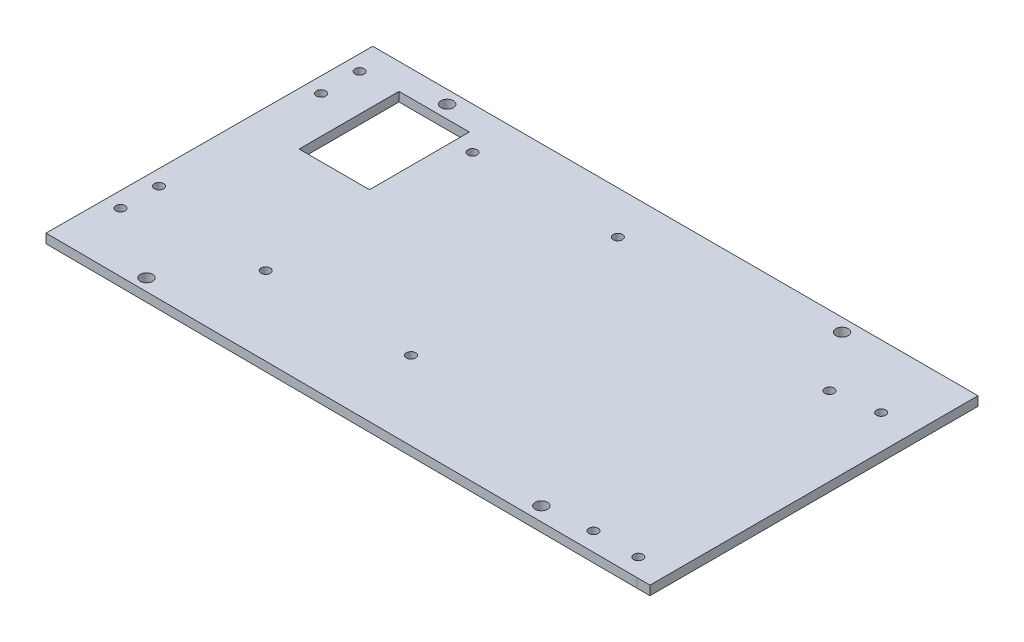
ISO-10303-21;
HEADER;
FILE_DESCRIPTION(('STEP AP214'),'2;1');
FILE_NAME('part.step','',(''),(''),'','','');
FILE_SCHEMA(('AUTOMOTIVE_DESIGN { 1 0 10303 214 1 1 1 1 }'));
ENDSEC;
DATA;
#1=APPLICATION_CONTEXT('core data for automotive mechanical design processes');
#2=APPLICATION_PROTOCOL_DEFINITION('international standard','automotive_design',2000,#1);
#3=PRODUCT_CONTEXT('',#1,'mechanical');
#4=PRODUCT('Part','Part','',(#3));
#5=PRODUCT_RELATED_PRODUCT_CATEGORY('part','',(#4));
#6=PRODUCT_DEFINITION_FORMATION('','',#4);
#7=PRODUCT_DEFINITION_CONTEXT('part definition',#1,'design');
#8=PRODUCT_DEFINITION('design','',#6,#7);
#9=PRODUCT_DEFINITION_SHAPE('','',#8);
#10=(LENGTH_UNIT() NAMED_UNIT(*) SI_UNIT(.MILLI.,.METRE.));
#11=(NAMED_UNIT(*) PLANE_ANGLE_UNIT() SI_UNIT($,.RADIAN.));
#12=(NAMED_UNIT(*) SI_UNIT($,.STERADIAN.) SOLID_ANGLE_UNIT());
#13=UNCERTAINTY_MEASURE_WITH_UNIT(LENGTH_MEASURE(1.E-05),#10,'distance_accuracy_value','');
#14=(GEOMETRIC_REPRESENTATION_CONTEXT(3) GLOBAL_UNCERTAINTY_ASSIGNED_CONTEXT((#13)) GLOBAL_UNIT_ASSIGNED_CONTEXT((#10,
#11,#12)) REPRESENTATION_CONTEXT('',''));
#15=CARTESIAN_POINT('',(0.,0.,0.));
#16=DIRECTION('',(0.,0.,1.));
#17=DIRECTION('',(1.,0.,0.));
#18=AXIS2_PLACEMENT_3D('',#15,#16,#17);
#19=CARTESIAN_POINT('',(0.,3.,0.));
#20=DIRECTION('',(0.,1.,0.));
#21=DIRECTION('',(0.,0.,1.));
#22=AXIS2_PLACEMENT_3D('',#19,#20,#21);
#23=PLANE('',#22);
#24=CARTESIAN_POINT('',(62.5485763507274,3.,-47.5530715626635));
#25=DIRECTION('',(0.,1.,0.));
#26=DIRECTION('',(0.,0.,1.));
#27=AXIS2_PLACEMENT_3D('',#24,#25,#26);
#28=CIRCLE('',#27,2.);
#29=CARTESIAN_POINT('',(62.5485763507274,3.,-45.5530715626635));
#30=VERTEX_POINT('',#29);
#31=EDGE_CURVE('E421',#30,#30,#28,.T.);
#32=ORIENTED_EDGE('',*,*,#31,.F.);
#33=EDGE_LOOP('',(#32));
#34=FACE_BOUND('',#33,.T.);
#35=CARTESIAN_POINT('',(-66.0035544548105,3.,50.3232121505816));
#36=DIRECTION('',(0.,1.,0.));
#37=DIRECTION('',(0.,0.,1.));
#38=AXIS2_PLACEMENT_3D('',#35,#36,#37);
#39=CIRCLE('',#38,2.);
#40=CARTESIAN_POINT('',(-66.0035544548105,3.,52.3232121505816));
#41=VERTEX_POINT('',#40);
#42=EDGE_CURVE('E156',#41,#41,#39,.T.);
#43=ORIENTED_EDGE('',*,*,#42,.F.);
#44=EDGE_LOOP('',(#43));
#45=FACE_BOUND('',#44,.T.);
#46=DIRECTION('',(0.,0.,-1.));
#47=VECTOR('',#46,1.);
#48=CARTESIAN_POINT('',(-94.4584424309316,3.,-48.7725749938729));
#49=LINE('',#48,#47);
#50=CARTESIAN_POINT('',(-94.4584424309316,3.,-48.8206347995592));
#51=VERTEX_POINT('',#50);
#52=CARTESIAN_POINT('',(-94.4584424309316,3.,-51.7725749938729));
#53=VERTEX_POINT('',#52);
#54=EDGE_CURVE('E125',#51,#53,#49,.T.);
#55=ORIENTED_EDGE('',*,*,#54,.F.);
#56=DIRECTION('',(-0.00480598056863235,0.,0.9999884512087));
#57=VECTOR('',#56,1.);
#58=CARTESIAN_POINT('',(-94.6908889943438,3.,-0.455087828247691));
#59=LINE('',#58,#57);
#60=CARTESIAN_POINT('',(-94.9529778314439,3.,54.0781768298242));
#61=VERTEX_POINT('',#60);
#62=EDGE_CURVE('E250',#51,#61,#59,.T.);
#63=ORIENTED_EDGE('',*,*,#62,.T.);
#64=DIRECTION('',(0.9999884512087,0.,0.00480598056863185));
#65=VECTOR('',#64,1.);
#66=CARTESIAN_POINT('',(-0.262088837100033,3.,54.5332646580718));
#67=LINE('',#66,#65);
#68=CARTESIAN_POINT('',(98.3617393098349,3.,55.0072543337579));
#69=VERTEX_POINT('',#68);
#70=EDGE_CURVE('E253',#61,#69,#67,.T.);
#71=ORIENTED_EDGE('',*,*,#70,.T.);
#72=DIRECTION('',(1.,0.,0.));
#73=VECTOR('',#72,1.);
#74=CARTESIAN_POINT('',(0.,3.,55.0072543337579));
#75=LINE('',#74,#73);
#76=CARTESIAN_POINT('',(102.586080733285,3.,55.0072543337579));
#77=VERTEX_POINT('',#76);
#78=EDGE_CURVE('E256',#69,#77,#75,.T.);
#79=ORIENTED_EDGE('',*,*,#78,.T.);
#80=DIRECTION('',(0.,0.,-1.));
#81=VECTOR('',#80,1.);
#82=CARTESIAN_POINT('',(102.586080733285,3.,0.));
#83=LINE('',#82,#81);
#84=CARTESIAN_POINT('',(102.586080733285,3.,-51.7725749938729));
#85=VERTEX_POINT('',#84);
#86=EDGE_CURVE('E147',#77,#85,#83,.T.);
#87=ORIENTED_EDGE('',*,*,#86,.T.);
#88=DIRECTION('',(1.,0.,0.));
#89=VECTOR('',#88,1.);
#90=CARTESIAN_POINT('',(102.586080733285,3.,-51.7725749938729));
#91=LINE('',#90,#89);
#92=EDGE_CURVE('E134',#53,#85,#91,.T.);
#93=ORIENTED_EDGE('',*,*,#92,.F.);
#94=EDGE_LOOP('',(#55,#63,#71,#79,#87,#93));
#95=FACE_BOUND('',#94,.T.);
#96=DIRECTION('',(0.,0.,1.));
#97=VECTOR('',#96,1.);
#98=CARTESIAN_POINT('',(-77.4584424309316,3.,0.));
#99=LINE('',#98,#97);
#100=CARTESIAN_POINT('',(-77.4584424309316,3.,-43.3335681314541));
#101=VERTEX_POINT('',#100);
#102=CARTESIAN_POINT('',(-77.4584424309316,3.,-10.8206347995592));
#103=VERTEX_POINT('',#102);
#104=EDGE_CURVE('E188',#101,#103,#99,.T.);
#105=ORIENTED_EDGE('',*,*,#104,.F.);
#106=DIRECTION('',(1.,0.,0.));
#107=VECTOR('',#106,1.);
#108=CARTESIAN_POINT('',(0.,3.,-43.3335681314541));
#109=LINE('',#108,#107);
#110=CARTESIAN_POINT('',(-54.5486664786895,3.,-43.3335681314541));
#111=VERTEX_POINT('',#110);
#112=EDGE_CURVE('E162',#101,#111,#109,.T.);
#113=ORIENTED_EDGE('',*,*,#112,.T.);
#114=DIRECTION('',(0.,0.,1.));
#115=VECTOR('',#114,1.);
#116=CARTESIAN_POINT('',(-54.5486664786895,3.,0.));
#117=LINE('',#116,#115);
#118=CARTESIAN_POINT('',(-54.5486664786895,3.,-10.8206347995592));
#119=VERTEX_POINT('',#118);
#120=EDGE_CURVE('E61',#111,#119,#117,.T.);
#121=ORIENTED_EDGE('',*,*,#120,.T.);
#122=DIRECTION('',(1.,0.,0.));
#123=VECTOR('',#122,1.);
#124=CARTESIAN_POINT('',(0.,3.,-10.8206347995592));
#125=LINE('',#124,#123);
#126=EDGE_CURVE('E179',#103,#119,#125,.T.);
#127=ORIENTED_EDGE('',*,*,#126,.F.);
#128=EDGE_LOOP('',(#105,#113,#121,#127));
#129=FACE_BOUND('',#128,.T.);
#130=CARTESIAN_POINT('',(92.7573821266623,3.,48.9802502974241));
#131=DIRECTION('',(0.,1.,0.));
#132=DIRECTION('',(0.,0.,1.));
#133=AXIS2_PLACEMENT_3D('',#130,#131,#132);
#134=CIRCLE('',#133,1.5);
#135=CARTESIAN_POINT('',(92.7573821266623,3.,50.4802502974241));
#136=VERTEX_POINT('',#135);
#137=EDGE_CURVE('E201',#136,#136,#134,.T.);
#138=ORIENTED_EDGE('',*,*,#137,.F.);
#139=EDGE_LOOP('',(#138));
#140=FACE_BOUND('',#139,.T.);
#141=CARTESIAN_POINT('',(78.1095131214086,3.,48.909852110599));
#142=DIRECTION('',(0.,1.,0.));
#143=DIRECTION('',(0.,0.,1.));
#144=AXIS2_PLACEMENT_3D('',#141,#142,#143);
#145=CIRCLE('',#144,1.5);
#146=CARTESIAN_POINT('',(78.1095131214086,3.,50.409852110599));
#147=VERTEX_POINT('',#146);
#148=EDGE_CURVE('E205',#147,#147,#145,.T.);
#149=ORIENTED_EDGE('',*,*,#148,.F.);
#150=EDGE_LOOP('',(#149));
#151=FACE_BOUND('',#150,.T.);
#152=CARTESIAN_POINT('',(-48.2970178521656,3.,-38.0986600641648));
#153=DIRECTION('',(0.,1.,0.));
#154=DIRECTION('',(0.,0.,1.));
#155=AXIS2_PLACEMENT_3D('',#152,#153,#154);
#156=CIRCLE('',#155,1.5);
#157=CARTESIAN_POINT('',(-48.2970178521656,3.,-36.5986600641648));
#158=VERTEX_POINT('',#157);
#159=EDGE_CURVE('E210',#158,#158,#156,.T.);
#160=ORIENTED_EDGE('',*,*,#159,.F.);
#161=EDGE_LOOP('',(#160));
#162=FACE_BOUND('',#161,.T.);
#163=CARTESIAN_POINT('',(-0.747960243058551,3.,-37.8701375780802));
#164=DIRECTION('',(0.,1.,0.));
#165=DIRECTION('',(0.,0.,1.));
#166=AXIS2_PLACEMENT_3D('',#163,#164,#165);
#167=CIRCLE('',#166,1.5);
#168=CARTESIAN_POINT('',(-0.747960243058551,3.,-36.3701375780802));
#169=VERTEX_POINT('',#168);
#170=EDGE_CURVE('E214',#169,#169,#167,.T.);
#171=ORIENTED_EDGE('',*,*,#170,.F.);
#172=EDGE_LOOP('',(#171));
#173=FACE_BOUND('',#172,.T.);
#174=CARTESIAN_POINT('',(91.5761646914357,3.,-31.2402327017265));
#175=DIRECTION('',(0.,1.,0.));
#176=DIRECTION('',(0.,0.,1.));
#177=AXIS2_PLACEMENT_3D('',#174,#175,#176);
#178=CIRCLE('',#177,1.5);
#179=CARTESIAN_POINT('',(91.5761646914357,3.,-29.7402327017265));
#180=VERTEX_POINT('',#179);
#181=EDGE_CURVE('E218',#180,#180,#178,.T.);
#182=ORIENTED_EDGE('',*,*,#181,.F.);
#183=EDGE_LOOP('',(#182));
#184=FACE_BOUND('',#183,.T.);
#185=CARTESIAN_POINT('',(77.015212265754,3.,-28.9963068000278));
#186=DIRECTION('',(0.,1.,0.));
#187=DIRECTION('',(0.,0.,1.));
#188=AXIS2_PLACEMENT_3D('',#185,#186,#187);
#189=CIRCLE('',#188,1.5);
#190=CARTESIAN_POINT('',(77.015212265754,3.,-27.4963068000278));
#191=VERTEX_POINT('',#190);
#192=EDGE_CURVE('E222',#191,#191,#189,.T.);
#193=ORIENTED_EDGE('',*,*,#192,.F.);
#194=EDGE_LOOP('',(#193));
#195=FACE_BOUND('',#194,.T.);
#196=CARTESIAN_POINT('',(-48.6190185502639,3.,28.9005661668188));
#197=DIRECTION('',(0.,1.,0.));
#198=DIRECTION('',(0.,0.,1.));
#199=AXIS2_PLACEMENT_3D('',#196,#197,#198);
#200=CIRCLE('',#199,1.5);
#201=CARTESIAN_POINT('',(-48.6190185502639,3.,30.4005661668188));
#202=VERTEX_POINT('',#201);
#203=EDGE_CURVE('E226',#202,#202,#200,.T.);
#204=ORIENTED_EDGE('',*,*,#203,.F.);
#205=EDGE_LOOP('',(#204));
#206=FACE_BOUND('',#205,.T.);
#207=CARTESIAN_POINT('',(-1.06996094115684,3.,29.1290886529034));
#208=DIRECTION('',(0.,1.,0.));
#209=DIRECTION('',(0.,0.,1.));
#210=AXIS2_PLACEMENT_3D('',#207,#208,#209);
#211=CIRCLE('',#210,1.5);
#212=CARTESIAN_POINT('',(-1.06996094115684,3.,30.6290886529034));
#213=VERTEX_POINT('',#212);
#214=EDGE_CURVE('E230',#213,#213,#211,.T.);
#215=ORIENTED_EDGE('',*,*,#214,.F.);
#216=EDGE_LOOP('',(#215));
#217=FACE_BOUND('',#216,.T.);
#218=CARTESIAN_POINT('',(-89.8513890863737,3.,34.9524509895953));
#219=DIRECTION('',(0.,1.,0.));
#220=DIRECTION('',(0.,0.,1.));
#221=AXIS2_PLACEMENT_3D('',#218,#219,#220);
#222=CIRCLE('',#221,1.5);
#223=CARTESIAN_POINT('',(-89.8513890863737,3.,36.4524509895953));
#224=VERTEX_POINT('',#223);
#225=EDGE_CURVE('E234',#224,#224,#222,.T.);
#226=ORIENTED_EDGE('',*,*,#225,.F.);
#227=EDGE_LOOP('',(#226));
#228=FACE_BOUND('',#227,.T.);
#229=CARTESIAN_POINT('',(-89.7913143292658,3.,22.4525953494866));
#230=DIRECTION('',(0.,1.,0.));
#231=DIRECTION('',(0.,0.,1.));
#232=AXIS2_PLACEMENT_3D('',#229,#230,#231);
#233=CIRCLE('',#232,1.5);
#234=CARTESIAN_POINT('',(-89.7913143292658,3.,23.9525953494866));
#235=VERTEX_POINT('',#234);
#236=EDGE_CURVE('E238',#235,#235,#233,.T.);
#237=ORIENTED_EDGE('',*,*,#236,.F.);
#238=EDGE_LOOP('',(#237));
#239=FACE_BOUND('',#238,.T.);
#240=CARTESIAN_POINT('',(-89.488537553442,3.,-42.5466770766617));
#241=DIRECTION('',(0.,1.,0.));
#242=DIRECTION('',(0.,0.,1.));
#243=AXIS2_PLACEMENT_3D('',#240,#241,#242);
#244=CIRCLE('',#243,1.5);
#245=CARTESIAN_POINT('',(-89.488537553442,3.,-41.0466770766617));
#246=VERTEX_POINT('',#245);
#247=EDGE_CURVE('E242',#246,#246,#244,.T.);
#248=ORIENTED_EDGE('',*,*,#247,.F.);
#249=EDGE_LOOP('',(#248));
#250=FACE_BOUND('',#249,.T.);
#251=CARTESIAN_POINT('',(-89.5486123105499,3.,-30.046821436553));
#252=DIRECTION('',(0.,1.,0.));
#253=DIRECTION('',(0.,0.,1.));
#254=AXIS2_PLACEMENT_3D('',#251,#252,#253);
#255=CIRCLE('',#254,1.5);
#256=CARTESIAN_POINT('',(-89.5486123105499,3.,-28.546821436553));
#257=VERTEX_POINT('',#256);
#258=EDGE_CURVE('E246',#257,#257,#255,.T.);
#259=ORIENTED_EDGE('',*,*,#258,.F.);
#260=EDGE_LOOP('',(#259));
#261=FACE_BOUND('',#260,.T.);
#262=CARTESIAN_POINT('',(62.5485763507274,3.,50.3232121505816));
#263=DIRECTION('',(0.,-1.,0.));
#264=DIRECTION('',(0.,0.,-1.));
#265=AXIS2_PLACEMENT_3D('',#262,#263,#264);
#266=CIRCLE('',#265,2.);
#267=CARTESIAN_POINT('',(62.5485763507274,3.,48.3232121505816));
#268=VERTEX_POINT('',#267);
#269=EDGE_CURVE('E405',#268,#268,#266,.T.);
#270=ORIENTED_EDGE('',*,*,#269,.T.);
#271=EDGE_LOOP('',(#270));
#272=FACE_BOUND('',#271,.T.);
#273=CARTESIAN_POINT('',(-66.0035544548105,3.,-47.5530715626635));
#274=DIRECTION('',(0.,-1.,0.));
#275=DIRECTION('',(0.,0.,-1.));
#276=AXIS2_PLACEMENT_3D('',#273,#274,#275);
#277=CIRCLE('',#276,2.);
#278=CARTESIAN_POINT('',(-66.0035544548105,3.,-49.5530715626635));
#279=VERTEX_POINT('',#278);
#280=EDGE_CURVE('E429',#279,#279,#277,.T.);
#281=ORIENTED_EDGE('',*,*,#280,.T.);
#282=EDGE_LOOP('',(#281));
#283=FACE_BOUND('',#282,.T.);
#284=ADVANCED_FACE('F45',(#34,#45,#95,#129,#140,#151,#162,#173,#184,#195,#206,#217,#228,#239,
#250,#261,#272,#283),#23,.T.);
#285=CARTESIAN_POINT('',(0.,0.,0.));
#286=DIRECTION('',(0.,1.,0.));
#287=DIRECTION('',(0.,0.,1.));
#288=AXIS2_PLACEMENT_3D('',#285,#286,#287);
#289=PLANE('',#288);
#290=CARTESIAN_POINT('',(62.5485763507274,0.,50.3232121505816));
#291=DIRECTION('',(0.,-1.,0.));
#292=DIRECTION('',(0.,0.,-1.));
#293=AXIS2_PLACEMENT_3D('',#290,#291,#292);
#294=CIRCLE('',#293,2.);
#295=CARTESIAN_POINT('',(62.5485763507274,0.,48.3232121505816));
#296=VERTEX_POINT('',#295);
#297=EDGE_CURVE('E408',#296,#296,#294,.T.);
#298=ORIENTED_EDGE('',*,*,#297,.F.);
#299=EDGE_LOOP('',(#298));
#300=FACE_BOUND('',#299,.T.);
#301=CARTESIAN_POINT('',(-66.0035544548105,0.,50.3232121505816));
#302=DIRECTION('',(0.,1.,0.));
#303=DIRECTION('',(0.,0.,1.));
#304=AXIS2_PLACEMENT_3D('',#301,#302,#303);
#305=CIRCLE('',#304,2.);
#306=CARTESIAN_POINT('',(-66.0035544548105,0.,52.3232121505816));
#307=VERTEX_POINT('',#306);
#308=EDGE_CURVE('E410',#307,#307,#305,.T.);
#309=ORIENTED_EDGE('',*,*,#308,.T.);
#310=EDGE_LOOP('',(#309));
#311=FACE_BOUND('',#310,.T.);
#312=DIRECTION('',(1.,0.,0.));
#313=VECTOR('',#312,1.);
#314=CARTESIAN_POINT('',(0.,0.,-43.3335681314541));
#315=LINE('',#314,#313);
#316=CARTESIAN_POINT('',(-77.4584424309316,0.,-43.3335681314541));
#317=VERTEX_POINT('',#316);
#318=CARTESIAN_POINT('',(-54.5486664786895,0.,-43.3335681314541));
#319=VERTEX_POINT('',#318);
#320=EDGE_CURVE('E160',#317,#319,#315,.T.);
#321=ORIENTED_EDGE('',*,*,#320,.F.);
#322=DIRECTION('',(0.,0.,1.));
#323=VECTOR('',#322,1.);
#324=CARTESIAN_POINT('',(-77.4584424309316,0.,0.));
#325=LINE('',#324,#323);
#326=CARTESIAN_POINT('',(-77.4584424309316,0.,-10.8206347995592));
#327=VERTEX_POINT('',#326);
#328=EDGE_CURVE('E178',#317,#327,#325,.T.);
#329=ORIENTED_EDGE('',*,*,#328,.T.);
#330=DIRECTION('',(1.,0.,0.));
#331=VECTOR('',#330,1.);
#332=CARTESIAN_POINT('',(0.,0.,-10.8206347995592));
#333=LINE('',#332,#331);
#334=CARTESIAN_POINT('',(-54.5486664786895,0.,-10.8206347995592));
#335=VERTEX_POINT('',#334);
#336=EDGE_CURVE('E69',#327,#335,#333,.T.);
#337=ORIENTED_EDGE('',*,*,#336,.T.);
#338=DIRECTION('',(0.,0.,1.));
#339=VECTOR('',#338,1.);
#340=CARTESIAN_POINT('',(-54.5486664786895,0.,0.));
#341=LINE('',#340,#339);
#342=EDGE_CURVE('E175',#319,#335,#341,.T.);
#343=ORIENTED_EDGE('',*,*,#342,.F.);
#344=EDGE_LOOP('',(#321,#329,#337,#343));
#345=FACE_BOUND('',#344,.T.);
#346=CARTESIAN_POINT('',(-89.5486123105499,0.,-30.046821436553));
#347=DIRECTION('',(0.,1.,0.));
#348=DIRECTION('',(0.,0.,1.));
#349=AXIS2_PLACEMENT_3D('',#346,#347,#348);
#350=CIRCLE('',#349,1.5);
#351=CARTESIAN_POINT('',(-89.5486123105499,0.,-28.546821436553));
#352=VERTEX_POINT('',#351);
#353=EDGE_CURVE('E305',#352,#352,#350,.T.);
#354=ORIENTED_EDGE('',*,*,#353,.T.);
#355=EDGE_LOOP('',(#354));
#356=FACE_BOUND('',#355,.T.);
#357=CARTESIAN_POINT('',(-89.488537553442,0.,-42.5466770766617));
#358=DIRECTION('',(0.,1.,0.));
#359=DIRECTION('',(0.,0.,1.));
#360=AXIS2_PLACEMENT_3D('',#357,#358,#359);
#361=CIRCLE('',#360,1.5);
#362=CARTESIAN_POINT('',(-89.488537553442,0.,-41.0466770766617));
#363=VERTEX_POINT('',#362);
#364=EDGE_CURVE('E301',#363,#363,#361,.T.);
#365=ORIENTED_EDGE('',*,*,#364,.T.);
#366=EDGE_LOOP('',(#365));
#367=FACE_BOUND('',#366,.T.);
#368=CARTESIAN_POINT('',(-89.7913143292658,0.,22.4525953494866));
#369=DIRECTION('',(0.,1.,0.));
#370=DIRECTION('',(0.,0.,1.));
#371=AXIS2_PLACEMENT_3D('',#368,#369,#370);
#372=CIRCLE('',#371,1.5);
#373=CARTESIAN_POINT('',(-89.7913143292658,0.,23.9525953494866));
#374=VERTEX_POINT('',#373);
#375=EDGE_CURVE('E297',#374,#374,#372,.T.);
#376=ORIENTED_EDGE('',*,*,#375,.T.);
#377=EDGE_LOOP('',(#376));
#378=FACE_BOUND('',#377,.T.);
#379=CARTESIAN_POINT('',(-89.8513890863737,0.,34.9524509895953));
#380=DIRECTION('',(0.,1.,0.));
#381=DIRECTION('',(0.,0.,1.));
#382=AXIS2_PLACEMENT_3D('',#379,#380,#381);
#383=CIRCLE('',#382,1.5);
#384=CARTESIAN_POINT('',(-89.8513890863737,0.,36.4524509895953));
#385=VERTEX_POINT('',#384);
#386=EDGE_CURVE('E293',#385,#385,#383,.T.);
#387=ORIENTED_EDGE('',*,*,#386,.T.);
#388=EDGE_LOOP('',(#387));
#389=FACE_BOUND('',#388,.T.);
#390=CARTESIAN_POINT('',(-1.06996094115684,0.,29.1290886529034));
#391=DIRECTION('',(0.,1.,0.));
#392=DIRECTION('',(0.,0.,1.));
#393=AXIS2_PLACEMENT_3D('',#390,#391,#392);
#394=CIRCLE('',#393,1.5);
#395=CARTESIAN_POINT('',(-1.06996094115684,0.,30.6290886529034));
#396=VERTEX_POINT('',#395);
#397=EDGE_CURVE('E289',#396,#396,#394,.T.);
#398=ORIENTED_EDGE('',*,*,#397,.T.);
#399=EDGE_LOOP('',(#398));
#400=FACE_BOUND('',#399,.T.);
#401=CARTESIAN_POINT('',(-48.6190185502639,0.,28.9005661668188));
#402=DIRECTION('',(0.,1.,0.));
#403=DIRECTION('',(0.,0.,1.));
#404=AXIS2_PLACEMENT_3D('',#401,#402,#403);
#405=CIRCLE('',#404,1.5);
#406=CARTESIAN_POINT('',(-48.6190185502639,0.,30.4005661668188));
#407=VERTEX_POINT('',#406);
#408=EDGE_CURVE('E285',#407,#407,#405,.T.);
#409=ORIENTED_EDGE('',*,*,#408,.T.);
#410=EDGE_LOOP('',(#409));
#411=FACE_BOUND('',#410,.T.);
#412=CARTESIAN_POINT('',(77.015212265754,0.,-28.9963068000278));
#413=DIRECTION('',(0.,1.,0.));
#414=DIRECTION('',(0.,0.,1.));
#415=AXIS2_PLACEMENT_3D('',#412,#413,#414);
#416=CIRCLE('',#415,1.5);
#417=CARTESIAN_POINT('',(77.015212265754,0.,-27.4963068000278));
#418=VERTEX_POINT('',#417);
#419=EDGE_CURVE('E281',#418,#418,#416,.T.);
#420=ORIENTED_EDGE('',*,*,#419,.T.);
#421=EDGE_LOOP('',(#420));
#422=FACE_BOUND('',#421,.T.);
#423=CARTESIAN_POINT('',(91.5761646914357,0.,-31.2402327017265));
#424=DIRECTION('',(0.,1.,0.));
#425=DIRECTION('',(0.,0.,1.));
#426=AXIS2_PLACEMENT_3D('',#423,#424,#425);
#427=CIRCLE('',#426,1.5);
#428=CARTESIAN_POINT('',(91.5761646914357,0.,-29.7402327017265));
#429=VERTEX_POINT('',#428);
#430=EDGE_CURVE('E277',#429,#429,#427,.T.);
#431=ORIENTED_EDGE('',*,*,#430,.T.);
#432=EDGE_LOOP('',(#431));
#433=FACE_BOUND('',#432,.T.);
#434=CARTESIAN_POINT('',(-0.747960243058551,0.,-37.8701375780802));
#435=DIRECTION('',(0.,1.,0.));
#436=DIRECTION('',(0.,0.,1.));
#437=AXIS2_PLACEMENT_3D('',#434,#435,#436);
#438=CIRCLE('',#437,1.5);
#439=CARTESIAN_POINT('',(-0.747960243058551,0.,-36.3701375780802));
#440=VERTEX_POINT('',#439);
#441=EDGE_CURVE('E273',#440,#440,#438,.T.);
#442=ORIENTED_EDGE('',*,*,#441,.T.);
#443=EDGE_LOOP('',(#442));
#444=FACE_BOUND('',#443,.T.);
#445=CARTESIAN_POINT('',(-48.2970178521656,0.,-38.0986600641648));
#446=DIRECTION('',(0.,1.,0.));
#447=DIRECTION('',(0.,0.,1.));
#448=AXIS2_PLACEMENT_3D('',#445,#446,#447);
#449=CIRCLE('',#448,1.5);
#450=CARTESIAN_POINT('',(-48.2970178521656,0.,-36.5986600641648));
#451=VERTEX_POINT('',#450);
#452=EDGE_CURVE('E269',#451,#451,#449,.T.);
#453=ORIENTED_EDGE('',*,*,#452,.T.);
#454=EDGE_LOOP('',(#453));
#455=FACE_BOUND('',#454,.T.);
#456=CARTESIAN_POINT('',(78.1095131214086,0.,48.909852110599));
#457=DIRECTION('',(0.,1.,0.));
#458=DIRECTION('',(0.,0.,1.));
#459=AXIS2_PLACEMENT_3D('',#456,#457,#458);
#460=CIRCLE('',#459,1.5);
#461=CARTESIAN_POINT('',(78.1095131214086,0.,50.409852110599));
#462=VERTEX_POINT('',#461);
#463=EDGE_CURVE('E265',#462,#462,#460,.T.);
#464=ORIENTED_EDGE('',*,*,#463,.T.);
#465=EDGE_LOOP('',(#464));
#466=FACE_BOUND('',#465,.T.);
#467=CARTESIAN_POINT('',(92.7573821266623,0.,48.9802502974241));
#468=DIRECTION('',(0.,1.,0.));
#469=DIRECTION('',(0.,0.,1.));
#470=AXIS2_PLACEMENT_3D('',#467,#468,#469);
#471=CIRCLE('',#470,1.5);
#472=CARTESIAN_POINT('',(92.7573821266623,0.,50.4802502974241));
#473=VERTEX_POINT('',#472);
#474=EDGE_CURVE('E198',#473,#473,#471,.T.);
#475=ORIENTED_EDGE('',*,*,#474,.T.);
#476=EDGE_LOOP('',(#475));
#477=FACE_BOUND('',#476,.T.);
#478=DIRECTION('',(-0.00480598056863235,0.,0.9999884512087));
#479=VECTOR('',#478,1.);
#480=CARTESIAN_POINT('',(-94.6908889943438,0.,-0.455087828247691));
#481=LINE('',#480,#479);
#482=CARTESIAN_POINT('',(-94.4584424309316,0.,-48.8206347995592));
#483=VERTEX_POINT('',#482);
#484=CARTESIAN_POINT('',(-94.9529778314439,0.,54.0781768298242));
#485=VERTEX_POINT('',#484);
#486=EDGE_CURVE('E309',#483,#485,#481,.T.);
#487=ORIENTED_EDGE('',*,*,#486,.F.);
#488=DIRECTION('',(0.,0.,-1.));
#489=VECTOR('',#488,1.);
#490=CARTESIAN_POINT('',(-94.4584424309316,0.,-48.7725749938729));
#491=LINE('',#490,#489);
#492=CARTESIAN_POINT('',(-94.4584424309316,0.,-51.7725749938729));
#493=VERTEX_POINT('',#492);
#494=EDGE_CURVE('E153',#483,#493,#491,.T.);
#495=ORIENTED_EDGE('',*,*,#494,.T.);
#496=DIRECTION('',(1.,0.,0.));
#497=VECTOR('',#496,1.);
#498=CARTESIAN_POINT('',(102.586080733285,0.,-51.7725749938729));
#499=LINE('',#498,#497);
#500=CARTESIAN_POINT('',(102.586080733285,0.,-51.7725749938729));
#501=VERTEX_POINT('',#500);
#502=EDGE_CURVE('E135',#493,#501,#499,.T.);
#503=ORIENTED_EDGE('',*,*,#502,.T.);
#504=DIRECTION('',(0.,0.,-1.));
#505=VECTOR('',#504,1.);
#506=CARTESIAN_POINT('',(102.586080733285,0.,0.));
#507=LINE('',#506,#505);
#508=CARTESIAN_POINT('',(102.586080733285,0.,55.0072543337579));
#509=VERTEX_POINT('',#508);
#510=EDGE_CURVE('E206',#509,#501,#507,.T.);
#511=ORIENTED_EDGE('',*,*,#510,.F.);
#512=DIRECTION('',(1.,0.,0.));
#513=VECTOR('',#512,1.);
#514=CARTESIAN_POINT('',(0.,0.,55.0072543337579));
#515=LINE('',#514,#513);
#516=CARTESIAN_POINT('',(98.3617393098349,0.,55.0072543337579));
#517=VERTEX_POINT('',#516);
#518=EDGE_CURVE('E315',#517,#509,#515,.T.);
#519=ORIENTED_EDGE('',*,*,#518,.F.);
#520=DIRECTION('',(0.9999884512087,0.,0.00480598056863185));
#521=VECTOR('',#520,1.);
#522=CARTESIAN_POINT('',(-0.262088837100033,0.,54.5332646580718));
#523=LINE('',#522,#521);
#524=EDGE_CURVE('E312',#485,#517,#523,.T.);
#525=ORIENTED_EDGE('',*,*,#524,.F.);
#526=EDGE_LOOP('',(#487,#495,#503,#511,#519,#525));
#527=FACE_BOUND('',#526,.T.);
#528=CARTESIAN_POINT('',(62.5485763507274,0.,-47.5530715626635));
#529=DIRECTION('',(0.,1.,0.));
#530=DIRECTION('',(0.,0.,1.));
#531=AXIS2_PLACEMENT_3D('',#528,#529,#530);
#532=CIRCLE('',#531,2.);
#533=CARTESIAN_POINT('',(62.5485763507274,0.,-45.5530715626635));
#534=VERTEX_POINT('',#533);
#535=EDGE_CURVE('E415',#534,#534,#532,.T.);
#536=ORIENTED_EDGE('',*,*,#535,.T.);
#537=EDGE_LOOP('',(#536));
#538=FACE_BOUND('',#537,.T.);
#539=CARTESIAN_POINT('',(-66.0035544548105,0.,-47.5530715626635));
#540=DIRECTION('',(0.,-1.,0.));
#541=DIRECTION('',(0.,0.,-1.));
#542=AXIS2_PLACEMENT_3D('',#539,#540,#541);
#543=CIRCLE('',#542,2.);
#544=CARTESIAN_POINT('',(-66.0035544548105,0.,-49.5530715626635));
#545=VERTEX_POINT('',#544);
#546=EDGE_CURVE('E425',#545,#545,#543,.T.);
#547=ORIENTED_EDGE('',*,*,#546,.F.);
#548=EDGE_LOOP('',(#547));
#549=FACE_BOUND('',#548,.T.);
#550=ADVANCED_FACE('F338',(#300,#311,#345,#356,#367,#378,#389,#400,#411,#422,#433,#444,#455,
#466,#477,#527,#538,#549),#289,.F.);
#551=CARTESIAN_POINT('',(-54.5486664786895,0.,0.));
#552=DIRECTION('',(-1.,0.,0.));
#553=DIRECTION('',(0.,0.,1.));
#554=AXIS2_PLACEMENT_3D('',#551,#552,#553);
#555=PLANE('',#554);
#556=ORIENTED_EDGE('',*,*,#120,.F.);
#557=DIRECTION('',(0.,-1.,0.));
#558=VECTOR('',#557,1.);
#559=CARTESIAN_POINT('',(-54.5486664786895,3.,-43.3335681314541));
#560=LINE('',#559,#558);
#561=EDGE_CURVE('E165',#111,#319,#560,.T.);
#562=ORIENTED_EDGE('',*,*,#561,.T.);
#563=ORIENTED_EDGE('',*,*,#342,.T.);
#564=DIRECTION('',(0.,1.,0.));
#565=VECTOR('',#564,1.);
#566=CARTESIAN_POINT('',(-54.5486664786895,0.,-10.8206347995592));
#567=LINE('',#566,#565);
#568=EDGE_CURVE('E195',#335,#119,#567,.T.);
#569=ORIENTED_EDGE('',*,*,#568,.T.);
#570=EDGE_LOOP('',(#556,#562,#563,#569));
#571=FACE_BOUND('',#570,.T.);
#572=ADVANCED_FACE('F366',(#571),#555,.T.);
#573=CARTESIAN_POINT('',(-94.6908889943438,3.,-0.455087828247691));
#574=DIRECTION('',(0.9999884512087,0.,0.00480598056863235));
#575=DIRECTION('',(0.00480598056863235,0.,-0.9999884512087));
#576=AXIS2_PLACEMENT_3D('',#573,#574,#575);
#577=PLANE('',#576);
#578=ORIENTED_EDGE('',*,*,#486,.T.);
#579=DIRECTION('',(0.,-1.,0.));
#580=VECTOR('',#579,1.);
#581=CARTESIAN_POINT('',(-94.9529778314439,3.,54.0781768298242));
#582=LINE('',#581,#580);
#583=EDGE_CURVE('E54',#61,#485,#582,.T.);
#584=ORIENTED_EDGE('',*,*,#583,.F.);
#585=ORIENTED_EDGE('',*,*,#62,.F.);
#586=DIRECTION('',(0.,-1.,0.));
#587=VECTOR('',#586,1.);
#588=CARTESIAN_POINT('',(-94.4584424309316,3.,-48.8206347995592));
#589=LINE('',#588,#587);
#590=EDGE_CURVE('E11',#51,#483,#589,.T.);
#591=ORIENTED_EDGE('',*,*,#590,.T.);
#592=EDGE_LOOP('',(#578,#584,#585,#591));
#593=FACE_BOUND('',#592,.T.);
#594=ADVANCED_FACE('F373',(#593),#577,.F.);
#595=CARTESIAN_POINT('',(-0.262088837100033,3.,54.5332646580718));
#596=DIRECTION('',(0.00480598056863185,0.,-0.9999884512087));
#597=DIRECTION('',(-0.9999884512087,0.,-0.00480598056863185));
#598=AXIS2_PLACEMENT_3D('',#595,#596,#597);
#599=PLANE('',#598);
#600=ORIENTED_EDGE('',*,*,#524,.T.);
#601=DIRECTION('',(0.,-1.,0.));
#602=VECTOR('',#601,1.);
#603=CARTESIAN_POINT('',(98.3617393098349,3.,55.0072543337579));
#604=LINE('',#603,#602);
#605=EDGE_CURVE('E323',#69,#517,#604,.T.);
#606=ORIENTED_EDGE('',*,*,#605,.F.);
#607=ORIENTED_EDGE('',*,*,#70,.F.);
#608=ORIENTED_EDGE('',*,*,#583,.T.);
#609=EDGE_LOOP('',(#600,#606,#607,#608));
#610=FACE_BOUND('',#609,.T.);
#611=ADVANCED_FACE('F332',(#610),#599,.F.);
#612=CARTESIAN_POINT('',(0.,3.,55.0072543337579));
#613=DIRECTION('',(0.,0.,-1.));
#614=DIRECTION('',(-1.,0.,0.));
#615=AXIS2_PLACEMENT_3D('',#612,#613,#614);
#616=PLANE('',#615);
#617=ORIENTED_EDGE('',*,*,#518,.T.);
#618=DIRECTION('',(0.,-1.,0.));
#619=VECTOR('',#618,1.);
#620=CARTESIAN_POINT('',(102.586080733285,3.,55.0072543337579));
#621=LINE('',#620,#619);
#622=EDGE_CURVE('E261',#77,#509,#621,.T.);
#623=ORIENTED_EDGE('',*,*,#622,.F.);
#624=ORIENTED_EDGE('',*,*,#78,.F.);
#625=ORIENTED_EDGE('',*,*,#605,.T.);
#626=EDGE_LOOP('',(#617,#623,#624,#625));
#627=FACE_BOUND('',#626,.T.);
#628=ADVANCED_FACE('F343',(#627),#616,.F.);
#629=CARTESIAN_POINT('',(-89.5486123105499,3.,-30.046821436553));
#630=DIRECTION('',(0.,-1.,0.));
#631=DIRECTION('',(0.,0.,-1.));
#632=AXIS2_PLACEMENT_3D('',#629,#630,#631);
#633=CYLINDRICAL_SURFACE('',#632,1.5);
#634=ORIENTED_EDGE('',*,*,#258,.T.);
#635=EDGE_LOOP('',(#634));
#636=FACE_BOUND('',#635,.T.);
#637=ORIENTED_EDGE('',*,*,#353,.F.);
#638=EDGE_LOOP('',(#637));
#639=FACE_BOUND('',#638,.T.);
#640=ADVANCED_FACE('F507',(#636,#639),#633,.F.);
#641=CARTESIAN_POINT('',(-89.488537553442,3.,-42.5466770766617));
#642=DIRECTION('',(0.,-1.,0.));
#643=DIRECTION('',(0.,0.,-1.));
#644=AXIS2_PLACEMENT_3D('',#641,#642,#643);
#645=CYLINDRICAL_SURFACE('',#644,1.5);
#646=ORIENTED_EDGE('',*,*,#247,.T.);
#647=EDGE_LOOP('',(#646));
#648=FACE_BOUND('',#647,.T.);
#649=ORIENTED_EDGE('',*,*,#364,.F.);
#650=EDGE_LOOP('',(#649));
#651=FACE_BOUND('',#650,.T.);
#652=ADVANCED_FACE('F503',(#648,#651),#645,.F.);
#653=CARTESIAN_POINT('',(-89.7913143292658,3.,22.4525953494866));
#654=DIRECTION('',(0.,-1.,0.));
#655=DIRECTION('',(0.,0.,-1.));
#656=AXIS2_PLACEMENT_3D('',#653,#654,#655);
#657=CYLINDRICAL_SURFACE('',#656,1.5);
#658=ORIENTED_EDGE('',*,*,#236,.T.);
#659=EDGE_LOOP('',(#658));
#660=FACE_BOUND('',#659,.T.);
#661=ORIENTED_EDGE('',*,*,#375,.F.);
#662=EDGE_LOOP('',(#661));
#663=FACE_BOUND('',#662,.T.);
#664=ADVANCED_FACE('F499',(#660,#663),#657,.F.);
#665=CARTESIAN_POINT('',(-89.8513890863737,3.,34.9524509895953));
#666=DIRECTION('',(0.,-1.,0.));
#667=DIRECTION('',(0.,0.,-1.));
#668=AXIS2_PLACEMENT_3D('',#665,#666,#667);
#669=CYLINDRICAL_SURFACE('',#668,1.5);
#670=ORIENTED_EDGE('',*,*,#225,.T.);
#671=EDGE_LOOP('',(#670));
#672=FACE_BOUND('',#671,.T.);
#673=ORIENTED_EDGE('',*,*,#386,.F.);
#674=EDGE_LOOP('',(#673));
#675=FACE_BOUND('',#674,.T.);
#676=ADVANCED_FACE('F495',(#672,#675),#669,.F.);
#677=CARTESIAN_POINT('',(-1.06996094115684,3.,29.1290886529034));
#678=DIRECTION('',(0.,-1.,0.));
#679=DIRECTION('',(0.,0.,-1.));
#680=AXIS2_PLACEMENT_3D('',#677,#678,#679);
#681=CYLINDRICAL_SURFACE('',#680,1.5);
#682=ORIENTED_EDGE('',*,*,#214,.T.);
#683=EDGE_LOOP('',(#682));
#684=FACE_BOUND('',#683,.T.);
#685=ORIENTED_EDGE('',*,*,#397,.F.);
#686=EDGE_LOOP('',(#685));
#687=FACE_BOUND('',#686,.T.);
#688=ADVANCED_FACE('F491',(#684,#687),#681,.F.);
#689=CARTESIAN_POINT('',(-48.6190185502639,3.,28.9005661668188));
#690=DIRECTION('',(0.,-1.,0.));
#691=DIRECTION('',(0.,0.,-1.));
#692=AXIS2_PLACEMENT_3D('',#689,#690,#691);
#693=CYLINDRICAL_SURFACE('',#692,1.5);
#694=ORIENTED_EDGE('',*,*,#203,.T.);
#695=EDGE_LOOP('',(#694));
#696=FACE_BOUND('',#695,.T.);
#697=ORIENTED_EDGE('',*,*,#408,.F.);
#698=EDGE_LOOP('',(#697));
#699=FACE_BOUND('',#698,.T.);
#700=ADVANCED_FACE('F487',(#696,#699),#693,.F.);
#701=CARTESIAN_POINT('',(77.015212265754,3.,-28.9963068000278));
#702=DIRECTION('',(0.,-1.,0.));
#703=DIRECTION('',(0.,0.,-1.));
#704=AXIS2_PLACEMENT_3D('',#701,#702,#703);
#705=CYLINDRICAL_SURFACE('',#704,1.5);
#706=ORIENTED_EDGE('',*,*,#192,.T.);
#707=EDGE_LOOP('',(#706));
#708=FACE_BOUND('',#707,.T.);
#709=ORIENTED_EDGE('',*,*,#419,.F.);
#710=EDGE_LOOP('',(#709));
#711=FACE_BOUND('',#710,.T.);
#712=ADVANCED_FACE('F483',(#708,#711),#705,.F.);
#713=CARTESIAN_POINT('',(91.5761646914357,3.,-31.2402327017265));
#714=DIRECTION('',(0.,-1.,0.));
#715=DIRECTION('',(0.,0.,-1.));
#716=AXIS2_PLACEMENT_3D('',#713,#714,#715);
#717=CYLINDRICAL_SURFACE('',#716,1.5);
#718=ORIENTED_EDGE('',*,*,#181,.T.);
#719=EDGE_LOOP('',(#718));
#720=FACE_BOUND('',#719,.T.);
#721=ORIENTED_EDGE('',*,*,#430,.F.);
#722=EDGE_LOOP('',(#721));
#723=FACE_BOUND('',#722,.T.);
#724=ADVANCED_FACE('F479',(#720,#723),#717,.F.);
#725=CARTESIAN_POINT('',(-0.747960243058551,3.,-37.8701375780802));
#726=DIRECTION('',(0.,-1.,0.));
#727=DIRECTION('',(0.,0.,-1.));
#728=AXIS2_PLACEMENT_3D('',#725,#726,#727);
#729=CYLINDRICAL_SURFACE('',#728,1.5);
#730=ORIENTED_EDGE('',*,*,#170,.T.);
#731=EDGE_LOOP('',(#730));
#732=FACE_BOUND('',#731,.T.);
#733=ORIENTED_EDGE('',*,*,#441,.F.);
#734=EDGE_LOOP('',(#733));
#735=FACE_BOUND('',#734,.T.);
#736=ADVANCED_FACE('F473',(#732,#735),#729,.F.);
#737=CARTESIAN_POINT('',(-48.2970178521656,3.,-38.0986600641648));
#738=DIRECTION('',(0.,-1.,0.));
#739=DIRECTION('',(0.,0.,-1.));
#740=AXIS2_PLACEMENT_3D('',#737,#738,#739);
#741=CYLINDRICAL_SURFACE('',#740,1.5);
#742=ORIENTED_EDGE('',*,*,#159,.T.);
#743=EDGE_LOOP('',(#742));
#744=FACE_BOUND('',#743,.T.);
#745=ORIENTED_EDGE('',*,*,#452,.F.);
#746=EDGE_LOOP('',(#745));
#747=FACE_BOUND('',#746,.T.);
#748=ADVANCED_FACE('F468',(#744,#747),#741,.F.);
#749=CARTESIAN_POINT('',(78.1095131214086,3.,48.909852110599));
#750=DIRECTION('',(0.,-1.,0.));
#751=DIRECTION('',(0.,0.,-1.));
#752=AXIS2_PLACEMENT_3D('',#749,#750,#751);
#753=CYLINDRICAL_SURFACE('',#752,1.5);
#754=ORIENTED_EDGE('',*,*,#148,.T.);
#755=EDGE_LOOP('',(#754));
#756=FACE_BOUND('',#755,.T.);
#757=ORIENTED_EDGE('',*,*,#463,.F.);
#758=EDGE_LOOP('',(#757));
#759=FACE_BOUND('',#758,.T.);
#760=ADVANCED_FACE('F356',(#756,#759),#753,.F.);
#761=CARTESIAN_POINT('',(92.7573821266623,3.,48.9802502974241));
#762=DIRECTION('',(0.,-1.,0.));
#763=DIRECTION('',(0.,0.,-1.));
#764=AXIS2_PLACEMENT_3D('',#761,#762,#763);
#765=CYLINDRICAL_SURFACE('',#764,1.5);
#766=ORIENTED_EDGE('',*,*,#137,.T.);
#767=EDGE_LOOP('',(#766));
#768=FACE_BOUND('',#767,.T.);
#769=ORIENTED_EDGE('',*,*,#474,.F.);
#770=EDGE_LOOP('',(#769));
#771=FACE_BOUND('',#770,.T.);
#772=ADVANCED_FACE('F47',(#768,#771),#765,.F.);
#773=CARTESIAN_POINT('',(102.586080733285,3.,0.));
#774=DIRECTION('',(-1.,0.,0.));
#775=DIRECTION('',(0.,0.,1.));
#776=AXIS2_PLACEMENT_3D('',#773,#774,#775);
#777=PLANE('',#776);
#778=ORIENTED_EDGE('',*,*,#510,.T.);
#779=DIRECTION('',(0.,-1.,0.));
#780=VECTOR('',#779,1.);
#781=CARTESIAN_POINT('',(102.586080733285,3.,-51.7725749938729));
#782=LINE('',#781,#780);
#783=EDGE_CURVE('E143',#85,#501,#782,.T.);
#784=ORIENTED_EDGE('',*,*,#783,.F.);
#785=ORIENTED_EDGE('',*,*,#86,.F.);
#786=ORIENTED_EDGE('',*,*,#622,.T.);
#787=EDGE_LOOP('',(#778,#784,#785,#786));
#788=FACE_BOUND('',#787,.T.);
#789=ADVANCED_FACE('F346',(#788),#777,.F.);
#790=CARTESIAN_POINT('',(0.,0.,-10.8206347995592));
#791=DIRECTION('',(0.,0.,1.));
#792=DIRECTION('',(1.,0.,0.));
#793=AXIS2_PLACEMENT_3D('',#790,#791,#792);
#794=PLANE('',#793);
#795=ORIENTED_EDGE('',*,*,#126,.T.);
#796=ORIENTED_EDGE('',*,*,#568,.F.);
#797=ORIENTED_EDGE('',*,*,#336,.F.);
#798=DIRECTION('',(0.,1.,0.));
#799=VECTOR('',#798,1.);
#800=CARTESIAN_POINT('',(-77.4584424309316,0.,-10.8206347995592));
#801=LINE('',#800,#799);
#802=EDGE_CURVE('E185',#327,#103,#801,.T.);
#803=ORIENTED_EDGE('',*,*,#802,.T.);
#804=EDGE_LOOP('',(#795,#796,#797,#803));
#805=FACE_BOUND('',#804,.T.);
#806=ADVANCED_FACE('F348',(#805),#794,.F.);
#807=CARTESIAN_POINT('',(-77.4584424309316,0.,0.));
#808=DIRECTION('',(-1.,0.,0.));
#809=DIRECTION('',(0.,0.,1.));
#810=AXIS2_PLACEMENT_3D('',#807,#808,#809);
#811=PLANE('',#810);
#812=ORIENTED_EDGE('',*,*,#104,.T.);
#813=ORIENTED_EDGE('',*,*,#802,.F.);
#814=ORIENTED_EDGE('',*,*,#328,.F.);
#815=DIRECTION('',(0.,-1.,0.));
#816=VECTOR('',#815,1.);
#817=CARTESIAN_POINT('',(-77.4584424309316,3.,-43.3335681314541));
#818=LINE('',#817,#816);
#819=EDGE_CURVE('E169',#101,#317,#818,.T.);
#820=ORIENTED_EDGE('',*,*,#819,.F.);
#821=EDGE_LOOP('',(#812,#813,#814,#820));
#822=FACE_BOUND('',#821,.T.);
#823=ADVANCED_FACE('F354',(#822),#811,.F.);
#824=CARTESIAN_POINT('',(0.,3.,-43.3335681314541));
#825=DIRECTION('',(0.,0.,-1.));
#826=DIRECTION('',(-1.,0.,0.));
#827=AXIS2_PLACEMENT_3D('',#824,#825,#826);
#828=PLANE('',#827);
#829=ORIENTED_EDGE('',*,*,#320,.T.);
#830=ORIENTED_EDGE('',*,*,#561,.F.);
#831=ORIENTED_EDGE('',*,*,#112,.F.);
#832=ORIENTED_EDGE('',*,*,#819,.T.);
#833=EDGE_LOOP('',(#829,#830,#831,#832));
#834=FACE_BOUND('',#833,.T.);
#835=ADVANCED_FACE('F375',(#834),#828,.F.);
#836=CARTESIAN_POINT('',(-94.4584424309316,3.,-48.7725749938729));
#837=DIRECTION('',(-1.,0.,0.));
#838=DIRECTION('',(0.,0.,1.));
#839=AXIS2_PLACEMENT_3D('',#836,#837,#838);
#840=PLANE('',#839);
#841=ORIENTED_EDGE('',*,*,#590,.F.);
#842=ORIENTED_EDGE('',*,*,#54,.T.);
#843=DIRECTION('',(0.,-1.,0.));
#844=VECTOR('',#843,1.);
#845=CARTESIAN_POINT('',(-94.4584424309316,3.,-51.7725749938729));
#846=LINE('',#845,#844);
#847=EDGE_CURVE('E129',#53,#493,#846,.T.);
#848=ORIENTED_EDGE('',*,*,#847,.T.);
#849=ORIENTED_EDGE('',*,*,#494,.F.);
#850=EDGE_LOOP('',(#841,#842,#848,#849));
#851=FACE_BOUND('',#850,.T.);
#852=ADVANCED_FACE('F127',(#851),#840,.T.);
#853=CARTESIAN_POINT('',(102.586080733285,3.,-51.7725749938729));
#854=DIRECTION('',(0.,0.,-1.));
#855=DIRECTION('',(-1.,0.,0.));
#856=AXIS2_PLACEMENT_3D('',#853,#854,#855);
#857=PLANE('',#856);
#858=ORIENTED_EDGE('',*,*,#502,.F.);
#859=ORIENTED_EDGE('',*,*,#847,.F.);
#860=ORIENTED_EDGE('',*,*,#92,.T.);
#861=ORIENTED_EDGE('',*,*,#783,.T.);
#862=EDGE_LOOP('',(#858,#859,#860,#861));
#863=FACE_BOUND('',#862,.T.);
#864=ADVANCED_FACE('F139',(#863),#857,.T.);
#865=CARTESIAN_POINT('',(-66.0035544548105,3.,50.3232121505816));
#866=DIRECTION('',(0.,-1.,0.));
#867=DIRECTION('',(0.,0.,-1.));
#868=AXIS2_PLACEMENT_3D('',#865,#866,#867);
#869=CYLINDRICAL_SURFACE('',#868,2.);
#870=ORIENTED_EDGE('',*,*,#42,.T.);
#871=EDGE_LOOP('',(#870));
#872=FACE_BOUND('',#871,.T.);
#873=ORIENTED_EDGE('',*,*,#308,.F.);
#874=EDGE_LOOP('',(#873));
#875=FACE_BOUND('',#874,.T.);
#876=ADVANCED_FACE('F385',(#872,#875),#869,.F.);
#877=CARTESIAN_POINT('',(62.5485763507274,3.,50.3232121505816));
#878=DIRECTION('',(0.,-1.,0.));
#879=DIRECTION('',(0.,0.,-1.));
#880=AXIS2_PLACEMENT_3D('',#877,#878,#879);
#881=CYLINDRICAL_SURFACE('',#880,2.);
#882=ORIENTED_EDGE('',*,*,#269,.F.);
#883=EDGE_LOOP('',(#882));
#884=FACE_BOUND('',#883,.T.);
#885=ORIENTED_EDGE('',*,*,#297,.T.);
#886=EDGE_LOOP('',(#885));
#887=FACE_BOUND('',#886,.T.);
#888=ADVANCED_FACE('F388',(#884,#887),#881,.F.);
#889=CARTESIAN_POINT('',(62.5485763507274,3.,-47.5530715626635));
#890=DIRECTION('',(0.,-1.,0.));
#891=DIRECTION('',(0.,0.,-1.));
#892=AXIS2_PLACEMENT_3D('',#889,#890,#891);
#893=CYLINDRICAL_SURFACE('',#892,2.);
#894=ORIENTED_EDGE('',*,*,#31,.T.);
#895=EDGE_LOOP('',(#894));
#896=FACE_BOUND('',#895,.T.);
#897=ORIENTED_EDGE('',*,*,#535,.F.);
#898=EDGE_LOOP('',(#897));
#899=FACE_BOUND('',#898,.T.);
#900=ADVANCED_FACE('F393',(#896,#899),#893,.F.);
#901=CARTESIAN_POINT('',(-66.0035544548105,3.,-47.5530715626635));
#902=DIRECTION('',(0.,-1.,0.));
#903=DIRECTION('',(0.,0.,-1.));
#904=AXIS2_PLACEMENT_3D('',#901,#902,#903);
#905=CYLINDRICAL_SURFACE('',#904,2.);
#906=ORIENTED_EDGE('',*,*,#280,.F.);
#907=EDGE_LOOP('',(#906));
#908=FACE_BOUND('',#907,.T.);
#909=ORIENTED_EDGE('',*,*,#546,.T.);
#910=EDGE_LOOP('',(#909));
#911=FACE_BOUND('',#910,.T.);
#912=ADVANCED_FACE('F390',(#908,#911),#905,.F.);
#913=CLOSED_SHELL('',(#284,#550,#572,#594,#611,#628,#640,#652,#664,#676,#688,#700,#712,#724,
#736,#748,#760,#772,#789,#806,#823,#835,#852,#864,#876,#888,#900,#912));
#914=MANIFOLD_SOLID_BREP('B2',#913);
#915=ADVANCED_BREP_SHAPE_REPRESENTATION('',(#18,#914),#14);
#916=SHAPE_DEFINITION_REPRESENTATION(#9,#915);
ENDSEC;
END-ISO-10303-21;
